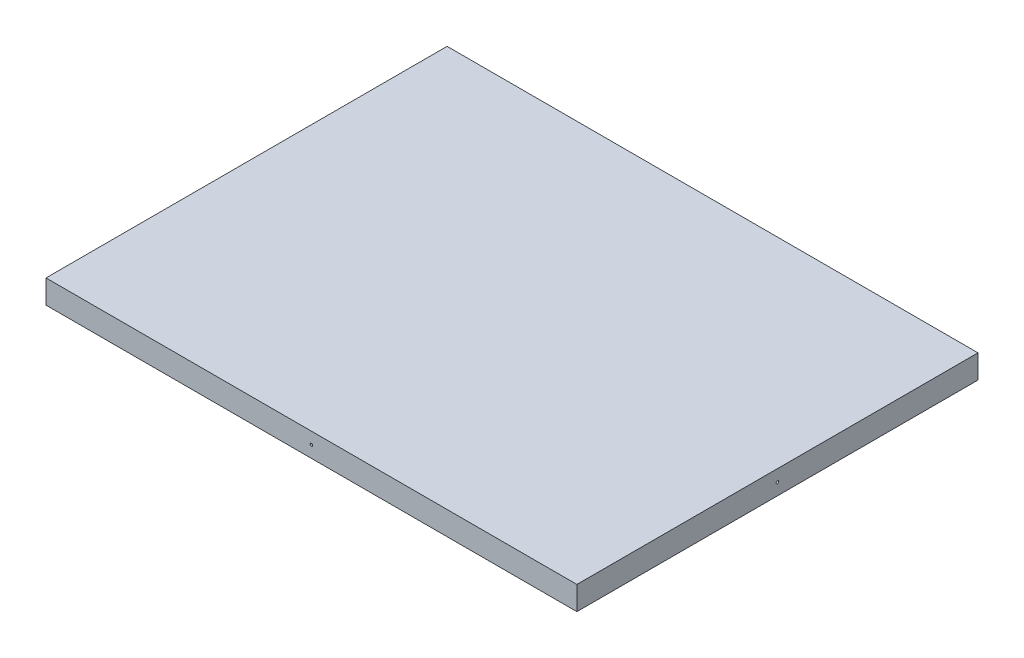
ISO-10303-21;
HEADER;
FILE_DESCRIPTION(('STEP AP214'),'2;1');
FILE_NAME('part.step','',(''),(''),'','','');
FILE_SCHEMA(('AUTOMOTIVE_DESIGN { 1 0 10303 214 1 1 1 1 }'));
ENDSEC;
DATA;
#1=APPLICATION_CONTEXT('core data for automotive mechanical design processes');
#2=APPLICATION_PROTOCOL_DEFINITION('international standard','automotive_design',2000,#1);
#3=PRODUCT_CONTEXT('',#1,'mechanical');
#4=PRODUCT('Part','Part','',(#3));
#5=PRODUCT_RELATED_PRODUCT_CATEGORY('part','',(#4));
#6=PRODUCT_DEFINITION_FORMATION('','',#4);
#7=PRODUCT_DEFINITION_CONTEXT('part definition',#1,'design');
#8=PRODUCT_DEFINITION('design','',#6,#7);
#9=PRODUCT_DEFINITION_SHAPE('','',#8);
#10=(LENGTH_UNIT() NAMED_UNIT(*) SI_UNIT(.MILLI.,.METRE.));
#11=(NAMED_UNIT(*) PLANE_ANGLE_UNIT() SI_UNIT($,.RADIAN.));
#12=(NAMED_UNIT(*) SI_UNIT($,.STERADIAN.) SOLID_ANGLE_UNIT());
#13=UNCERTAINTY_MEASURE_WITH_UNIT(LENGTH_MEASURE(1.E-05),#10,'distance_accuracy_value','');
#14=(GEOMETRIC_REPRESENTATION_CONTEXT(3) GLOBAL_UNCERTAINTY_ASSIGNED_CONTEXT((#13)) GLOBAL_UNIT_ASSIGNED_CONTEXT((#10,
#11,#12)) REPRESENTATION_CONTEXT('',''));
#15=CARTESIAN_POINT('',(0.,0.,0.));
#16=DIRECTION('',(0.,0.,1.));
#17=DIRECTION('',(1.,0.,0.));
#18=AXIS2_PLACEMENT_3D('',#15,#16,#17);
#19=CARTESIAN_POINT('',(1.66533453693773E-13,20.,340.));
#20=DIRECTION('',(0.,0.,1.));
#21=DIRECTION('',(1.,0.,0.));
#22=AXIS2_PLACEMENT_3D('',#19,#20,#21);
#23=CYLINDRICAL_SURFACE('',#22,2.09999999999995);
#24=CARTESIAN_POINT('',(1.66533453693773E-13,20.,340.));
#25=DIRECTION('',(0.,0.,1.));
#26=DIRECTION('',(1.,0.,0.));
#27=AXIS2_PLACEMENT_3D('',#24,#25,#26);
#28=CIRCLE('',#27,2.09999999999999);
#29=CARTESIAN_POINT('',(2.10000000000015,20.,340.));
#30=VERTEX_POINT('',#29);
#31=EDGE_CURVE('E156',#30,#30,#28,.T.);
#32=ORIENTED_EDGE('',*,*,#31,.T.);
#33=EDGE_LOOP('',(#32));
#34=FACE_BOUND('',#33,.T.);
#35=CARTESIAN_POINT('',(1.66533453693773E-13,20.,0.));
#36=DIRECTION('',(0.707106781186548,0.,0.707106781186547));
#37=DIRECTION('',(-0.707106781186547,0.,0.707106781186548));
#38=AXIS2_PLACEMENT_3D('',#35,#36,#37);
#39=ELLIPSE('',#38,2.96984848098342,2.09999999999995);
#40=CARTESIAN_POINT('',(1.66533453693773E-13,17.9000000000001,0.));
#41=VERTEX_POINT('',#40);
#42=CARTESIAN_POINT('',(1.66533453693773E-13,22.0999999999999,0.));
#43=VERTEX_POINT('',#42);
#44=EDGE_CURVE('E59',#41,#43,#39,.F.);
#45=ORIENTED_EDGE('',*,*,#44,.T.);
#46=CARTESIAN_POINT('',(1.66533453693773E-13,20.,0.));
#47=DIRECTION('',(-0.707106781186547,0.,0.707106781186548));
#48=DIRECTION('',(0.707106781186548,0.,0.707106781186547));
#49=AXIS2_PLACEMENT_3D('',#46,#47,#48);
#50=ELLIPSE('',#49,2.96984848098342,2.09999999999995);
#51=EDGE_CURVE('E11',#43,#41,#50,.F.);
#52=ORIENTED_EDGE('',*,*,#51,.T.);
#53=EDGE_LOOP('',(#45,#52));
#54=FACE_BOUND('',#53,.T.);
#55=ADVANCED_FACE('F45',(#34,#54),#23,.F.);
#56=CARTESIAN_POINT('',(450.,40.,-340.));
#57=DIRECTION('',(-1.,0.,0.));
#58=DIRECTION('',(0.,0.,1.));
#59=AXIS2_PLACEMENT_3D('',#56,#57,#58);
#60=PLANE('',#59);
#61=CARTESIAN_POINT('',(450.,20.,0.));
#62=DIRECTION('',(-1.,0.,0.));
#63=DIRECTION('',(0.,0.,1.));
#64=AXIS2_PLACEMENT_3D('',#61,#62,#63);
#65=CIRCLE('',#64,2.09999999999989);
#66=CARTESIAN_POINT('',(450.,20.,2.09999999999982));
#67=VERTEX_POINT('',#66);
#68=EDGE_CURVE('E160',#67,#67,#65,.T.);
#69=ORIENTED_EDGE('',*,*,#68,.T.);
#70=EDGE_LOOP('',(#69));
#71=FACE_BOUND('',#70,.T.);
#72=DIRECTION('',(0.,0.,-1.));
#73=VECTOR('',#72,1.);
#74=CARTESIAN_POINT('',(450.,0.,-340.));
#75=LINE('',#74,#73);
#76=CARTESIAN_POINT('',(450.,0.,340.));
#77=VERTEX_POINT('',#76);
#78=CARTESIAN_POINT('',(450.,0.,-340.));
#79=VERTEX_POINT('',#78);
#80=EDGE_CURVE('E139',#77,#79,#75,.T.);
#81=ORIENTED_EDGE('',*,*,#80,.T.);
#82=DIRECTION('',(0.,-1.,0.));
#83=VECTOR('',#82,1.);
#84=CARTESIAN_POINT('',(450.,40.,-340.));
#85=LINE('',#84,#83);
#86=CARTESIAN_POINT('',(450.,40.,-340.));
#87=VERTEX_POINT('',#86);
#88=EDGE_CURVE('E112',#87,#79,#85,.T.);
#89=ORIENTED_EDGE('',*,*,#88,.F.);
#90=DIRECTION('',(0.,0.,-1.));
#91=VECTOR('',#90,1.);
#92=CARTESIAN_POINT('',(450.,40.,-340.));
#93=LINE('',#92,#91);
#94=CARTESIAN_POINT('',(450.,40.,340.));
#95=VERTEX_POINT('',#94);
#96=EDGE_CURVE('E132',#95,#87,#93,.T.);
#97=ORIENTED_EDGE('',*,*,#96,.F.);
#98=DIRECTION('',(0.,-1.,0.));
#99=VECTOR('',#98,1.);
#100=CARTESIAN_POINT('',(450.,40.,340.));
#101=LINE('',#100,#99);
#102=EDGE_CURVE('E127',#95,#77,#101,.T.);
#103=ORIENTED_EDGE('',*,*,#102,.T.);
#104=EDGE_LOOP('',(#81,#89,#97,#103));
#105=FACE_BOUND('',#104,.T.);
#106=ADVANCED_FACE('F47',(#71,#105),#60,.F.);
#107=CARTESIAN_POINT('',(-450.,40.,-340.));
#108=DIRECTION('',(0.,0.,1.));
#109=DIRECTION('',(1.,0.,0.));
#110=AXIS2_PLACEMENT_3D('',#107,#108,#109);
#111=PLANE('',#110);
#112=CARTESIAN_POINT('',(1.66533453693773E-13,20.,-340.));
#113=DIRECTION('',(0.,0.,1.));
#114=DIRECTION('',(1.,0.,0.));
#115=AXIS2_PLACEMENT_3D('',#112,#113,#114);
#116=CIRCLE('',#115,2.09999999999992);
#117=CARTESIAN_POINT('',(2.10000000000008,20.,-340.));
#118=VERTEX_POINT('',#117);
#119=EDGE_CURVE('E143',#118,#118,#116,.T.);
#120=ORIENTED_EDGE('',*,*,#119,.T.);
#121=EDGE_LOOP('',(#120));
#122=FACE_BOUND('',#121,.T.);
#123=DIRECTION('',(-1.,0.,0.));
#124=VECTOR('',#123,1.);
#125=CARTESIAN_POINT('',(-450.,0.,-340.));
#126=LINE('',#125,#124);
#127=CARTESIAN_POINT('',(-450.,0.,-340.));
#128=VERTEX_POINT('',#127);
#129=EDGE_CURVE('E136',#79,#128,#126,.T.);
#130=ORIENTED_EDGE('',*,*,#129,.T.);
#131=DIRECTION('',(0.,-1.,0.));
#132=VECTOR('',#131,1.);
#133=CARTESIAN_POINT('',(-450.,40.,-340.));
#134=LINE('',#133,#132);
#135=CARTESIAN_POINT('',(-450.,40.,-340.));
#136=VERTEX_POINT('',#135);
#137=EDGE_CURVE('E120',#136,#128,#134,.T.);
#138=ORIENTED_EDGE('',*,*,#137,.F.);
#139=DIRECTION('',(-1.,0.,0.));
#140=VECTOR('',#139,1.);
#141=CARTESIAN_POINT('',(-450.,40.,-340.));
#142=LINE('',#141,#140);
#143=EDGE_CURVE('E97',#87,#136,#142,.T.);
#144=ORIENTED_EDGE('',*,*,#143,.F.);
#145=ORIENTED_EDGE('',*,*,#88,.T.);
#146=EDGE_LOOP('',(#130,#138,#144,#145));
#147=FACE_BOUND('',#146,.T.);
#148=ADVANCED_FACE('F174',(#122,#147),#111,.F.);
#149=CARTESIAN_POINT('',(-450.,40.,-340.));
#150=DIRECTION('',(1.,0.,0.));
#151=DIRECTION('',(0.,0.,-1.));
#152=AXIS2_PLACEMENT_3D('',#149,#150,#151);
#153=PLANE('',#152);
#154=CARTESIAN_POINT('',(-450.,20.,0.));
#155=DIRECTION('',(-1.,0.,0.));
#156=DIRECTION('',(0.,0.,1.));
#157=AXIS2_PLACEMENT_3D('',#154,#155,#156);
#158=CIRCLE('',#157,2.09999999999999);
#159=CARTESIAN_POINT('',(-450.,20.,2.10000000000006));
#160=VERTEX_POINT('',#159);
#161=EDGE_CURVE('E164',#160,#160,#158,.T.);
#162=ORIENTED_EDGE('',*,*,#161,.F.);
#163=EDGE_LOOP('',(#162));
#164=FACE_BOUND('',#163,.T.);
#165=DIRECTION('',(0.,0.,1.));
#166=VECTOR('',#165,1.);
#167=CARTESIAN_POINT('',(-450.,0.,-340.));
#168=LINE('',#167,#166);
#169=CARTESIAN_POINT('',(-450.,0.,340.));
#170=VERTEX_POINT('',#169);
#171=EDGE_CURVE('E133',#128,#170,#168,.T.);
#172=ORIENTED_EDGE('',*,*,#171,.T.);
#173=DIRECTION('',(0.,-1.,0.));
#174=VECTOR('',#173,1.);
#175=CARTESIAN_POINT('',(-450.,40.,340.));
#176=LINE('',#175,#174);
#177=CARTESIAN_POINT('',(-450.,40.,340.));
#178=VERTEX_POINT('',#177);
#179=EDGE_CURVE('E124',#178,#170,#176,.T.);
#180=ORIENTED_EDGE('',*,*,#179,.F.);
#181=DIRECTION('',(0.,0.,1.));
#182=VECTOR('',#181,1.);
#183=CARTESIAN_POINT('',(-450.,40.,-340.));
#184=LINE('',#183,#182);
#185=EDGE_CURVE('E146',#136,#178,#184,.T.);
#186=ORIENTED_EDGE('',*,*,#185,.F.);
#187=ORIENTED_EDGE('',*,*,#137,.T.);
#188=EDGE_LOOP('',(#172,#180,#186,#187));
#189=FACE_BOUND('',#188,.T.);
#190=ADVANCED_FACE('F170',(#164,#189),#153,.F.);
#191=CARTESIAN_POINT('',(-450.,40.,340.));
#192=DIRECTION('',(0.,0.,-1.));
#193=DIRECTION('',(-1.,0.,0.));
#194=AXIS2_PLACEMENT_3D('',#191,#192,#193);
#195=PLANE('',#194);
#196=ORIENTED_EDGE('',*,*,#31,.F.);
#197=EDGE_LOOP('',(#196));
#198=FACE_BOUND('',#197,.T.);
#199=DIRECTION('',(1.,0.,0.));
#200=VECTOR('',#199,1.);
#201=CARTESIAN_POINT('',(-450.,0.,340.));
#202=LINE('',#201,#200);
#203=EDGE_CURVE('E89',#170,#77,#202,.T.);
#204=ORIENTED_EDGE('',*,*,#203,.T.);
#205=ORIENTED_EDGE('',*,*,#102,.F.);
#206=DIRECTION('',(1.,0.,0.));
#207=VECTOR('',#206,1.);
#208=CARTESIAN_POINT('',(-450.,40.,340.));
#209=LINE('',#208,#207);
#210=EDGE_CURVE('E68',#178,#95,#209,.T.);
#211=ORIENTED_EDGE('',*,*,#210,.F.);
#212=ORIENTED_EDGE('',*,*,#179,.T.);
#213=EDGE_LOOP('',(#204,#205,#211,#212));
#214=FACE_BOUND('',#213,.T.);
#215=ADVANCED_FACE('F173',(#198,#214),#195,.F.);
#216=CARTESIAN_POINT('',(0.,40.,0.));
#217=DIRECTION('',(0.,1.,0.));
#218=DIRECTION('',(0.,0.,1.));
#219=AXIS2_PLACEMENT_3D('',#216,#217,#218);
#220=PLANE('',#219);
#221=ORIENTED_EDGE('',*,*,#96,.T.);
#222=ORIENTED_EDGE('',*,*,#143,.T.);
#223=ORIENTED_EDGE('',*,*,#185,.T.);
#224=ORIENTED_EDGE('',*,*,#210,.T.);
#225=EDGE_LOOP('',(#221,#222,#223,#224));
#226=FACE_BOUND('',#225,.T.);
#227=ADVANCED_FACE('F185',(#226),#220,.T.);
#228=CARTESIAN_POINT('',(0.,0.,0.));
#229=DIRECTION('',(0.,1.,0.));
#230=DIRECTION('',(0.,0.,1.));
#231=AXIS2_PLACEMENT_3D('',#228,#229,#230);
#232=PLANE('',#231);
#233=ORIENTED_EDGE('',*,*,#80,.F.);
#234=ORIENTED_EDGE('',*,*,#203,.F.);
#235=ORIENTED_EDGE('',*,*,#171,.F.);
#236=ORIENTED_EDGE('',*,*,#129,.F.);
#237=EDGE_LOOP('',(#233,#234,#235,#236));
#238=FACE_BOUND('',#237,.T.);
#239=ADVANCED_FACE('F181',(#238),#232,.F.);
#240=CARTESIAN_POINT('',(1.66533453693773E-13,20.,0.));
#241=DIRECTION('',(0.707106781186548,0.,0.707106781186547));
#242=DIRECTION('',(-0.707106781186547,0.,0.707106781186548));
#243=AXIS2_PLACEMENT_3D('',#240,#241,#242);
#244=ELLIPSE('',#243,2.96984848098342,2.09999999999995);
#245=EDGE_CURVE('E103',#41,#43,#244,.T.);
#246=ORIENTED_EDGE('',*,*,#245,.T.);
#247=CARTESIAN_POINT('',(1.66533453693773E-13,20.,0.));
#248=DIRECTION('',(-0.707106781186547,0.,0.707106781186548));
#249=DIRECTION('',(0.707106781186548,0.,0.707106781186547));
#250=AXIS2_PLACEMENT_3D('',#247,#248,#249);
#251=ELLIPSE('',#250,2.96984848098342,2.09999999999995);
#252=EDGE_CURVE('E54',#43,#41,#251,.T.);
#253=ORIENTED_EDGE('',*,*,#252,.T.);
#254=EDGE_LOOP('',(#246,#253));
#255=FACE_BOUND('',#254,.T.);
#256=ORIENTED_EDGE('',*,*,#119,.F.);
#257=EDGE_LOOP('',(#256));
#258=FACE_BOUND('',#257,.T.);
#259=ADVANCED_FACE('F114',(#255,#258),#23,.F.);
#260=CARTESIAN_POINT('',(-450.,20.,0.));
#261=DIRECTION('',(-1.,0.,0.));
#262=DIRECTION('',(0.,0.,1.));
#263=AXIS2_PLACEMENT_3D('',#260,#261,#262);
#264=CYLINDRICAL_SURFACE('',#263,2.09999999999994);
#265=ORIENTED_EDGE('',*,*,#161,.T.);
#266=EDGE_LOOP('',(#265));
#267=FACE_BOUND('',#266,.T.);
#268=ORIENTED_EDGE('',*,*,#44,.F.);
#269=ORIENTED_EDGE('',*,*,#252,.F.);
#270=EDGE_LOOP('',(#268,#269));
#271=FACE_BOUND('',#270,.T.);
#272=ADVANCED_FACE('F110',(#267,#271),#264,.F.);
#273=ORIENTED_EDGE('',*,*,#68,.F.);
#274=EDGE_LOOP('',(#273));
#275=FACE_BOUND('',#274,.T.);
#276=ORIENTED_EDGE('',*,*,#245,.F.);
#277=ORIENTED_EDGE('',*,*,#51,.F.);
#278=EDGE_LOOP('',(#276,#277));
#279=FACE_BOUND('',#278,.T.);
#280=ADVANCED_FACE('F104',(#275,#279),#264,.F.);
#281=CLOSED_SHELL('',(#55,#106,#148,#190,#215,#227,#239,#259,#272,#280));
#282=MANIFOLD_SOLID_BREP('B2',#281);
#283=ADVANCED_BREP_SHAPE_REPRESENTATION('',(#18,#282),#14);
#284=SHAPE_DEFINITION_REPRESENTATION(#9,#283);
ENDSEC;
END-ISO-10303-21;
